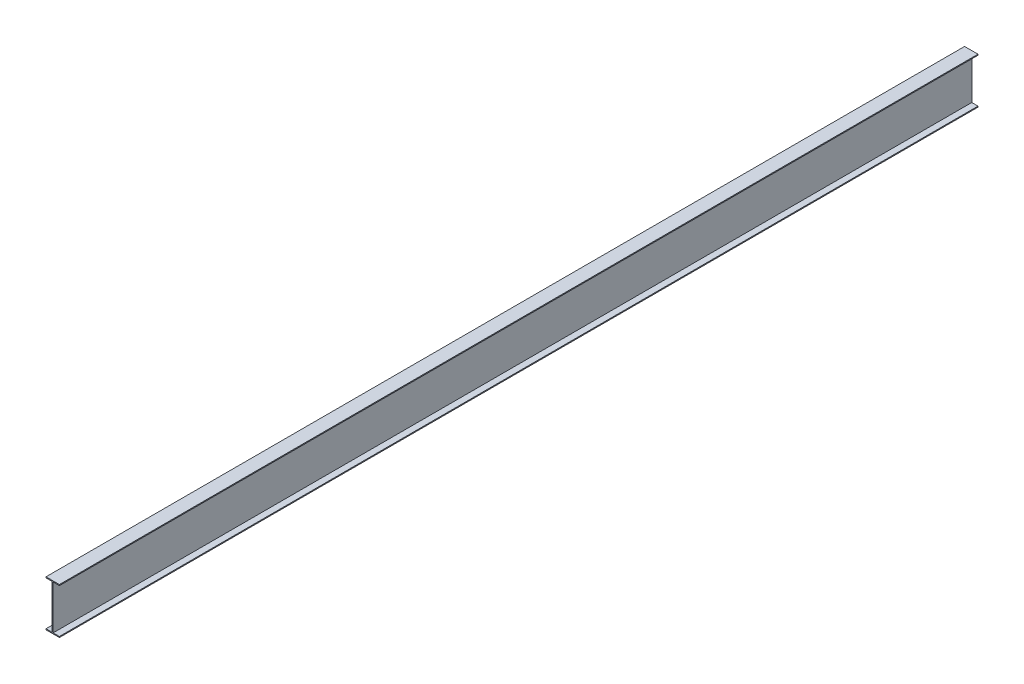
ISO-10303-21;
HEADER;
FILE_DESCRIPTION(('STEP AP214'),'2;1');
FILE_NAME('part.step','',(''),(''),'','','');
FILE_SCHEMA(('AUTOMOTIVE_DESIGN { 1 0 10303 214 1 1 1 1 }'));
ENDSEC;
DATA;
#1=APPLICATION_CONTEXT('core data for automotive mechanical design processes');
#2=APPLICATION_PROTOCOL_DEFINITION('international standard','automotive_design',2000,#1);
#3=PRODUCT_CONTEXT('',#1,'mechanical');
#4=PRODUCT('Part','Part','',(#3));
#5=PRODUCT_RELATED_PRODUCT_CATEGORY('part','',(#4));
#6=PRODUCT_DEFINITION_FORMATION('','',#4);
#7=PRODUCT_DEFINITION_CONTEXT('part definition',#1,'design');
#8=PRODUCT_DEFINITION('design','',#6,#7);
#9=PRODUCT_DEFINITION_SHAPE('','',#8);
#10=(LENGTH_UNIT() NAMED_UNIT(*) SI_UNIT(.MILLI.,.METRE.));
#11=(NAMED_UNIT(*) PLANE_ANGLE_UNIT() SI_UNIT($,.RADIAN.));
#12=(NAMED_UNIT(*) SI_UNIT($,.STERADIAN.) SOLID_ANGLE_UNIT());
#13=UNCERTAINTY_MEASURE_WITH_UNIT(LENGTH_MEASURE(1.E-05),#10,'distance_accuracy_value','');
#14=(GEOMETRIC_REPRESENTATION_CONTEXT(3) GLOBAL_UNCERTAINTY_ASSIGNED_CONTEXT((#13)) GLOBAL_UNIT_ASSIGNED_CONTEXT((#10,
#11,#12)) REPRESENTATION_CONTEXT('',''));
#15=CARTESIAN_POINT('',(0.,0.,0.));
#16=DIRECTION('',(0.,0.,1.));
#17=DIRECTION('',(1.,0.,0.));
#18=AXIS2_PLACEMENT_3D('',#15,#16,#17);
#19=CARTESIAN_POINT('',(6.35000000000003,-292.099999999999,12192.));
#20=DIRECTION('',(0.,-1.,0.));
#21=DIRECTION('',(1.,0.,0.));
#22=AXIS2_PLACEMENT_3D('',#19,#20,#21);
#23=PLANE('',#22);
#24=DIRECTION('',(-1.,0.,0.));
#25=VECTOR('',#24,1.);
#26=CARTESIAN_POINT('',(6.35000000000003,-292.099999999999,0.));
#27=LINE('',#26,#25);
#28=CARTESIAN_POINT('',(88.9,-292.099999999999,0.));
#29=VERTEX_POINT('',#28);
#30=CARTESIAN_POINT('',(6.35000000000003,-292.099999999999,0.));
#31=VERTEX_POINT('',#30);
#32=EDGE_CURVE('E154',#29,#31,#27,.T.);
#33=ORIENTED_EDGE('',*,*,#32,.T.);
#34=DIRECTION('',(0.,0.,-1.));
#35=VECTOR('',#34,1.);
#36=CARTESIAN_POINT('',(6.35000000000003,-292.099999999999,12192.));
#37=LINE('',#36,#35);
#38=CARTESIAN_POINT('',(6.35000000000003,-292.099999999999,12192.));
#39=VERTEX_POINT('',#38);
#40=EDGE_CURVE('E11',#39,#31,#37,.T.);
#41=ORIENTED_EDGE('',*,*,#40,.F.);
#42=DIRECTION('',(-1.,0.,0.));
#43=VECTOR('',#42,1.);
#44=CARTESIAN_POINT('',(6.35000000000003,-292.099999999999,12192.));
#45=LINE('',#44,#43);
#46=CARTESIAN_POINT('',(88.9,-292.099999999999,12192.));
#47=VERTEX_POINT('',#46);
#48=EDGE_CURVE('E176',#47,#39,#45,.T.);
#49=ORIENTED_EDGE('',*,*,#48,.F.);
#50=DIRECTION('',(0.,0.,-1.));
#51=VECTOR('',#50,1.);
#52=CARTESIAN_POINT('',(88.9,-292.099999999999,12192.));
#53=LINE('',#52,#51);
#54=EDGE_CURVE('E150',#47,#29,#53,.T.);
#55=ORIENTED_EDGE('',*,*,#54,.T.);
#56=EDGE_LOOP('',(#33,#41,#49,#55));
#57=FACE_BOUND('',#56,.T.);
#58=ADVANCED_FACE('F34',(#57),#23,.F.);
#59=CARTESIAN_POINT('',(6.34999999999996,292.100000000001,12192.));
#60=DIRECTION('',(-1.,0.,0.));
#61=DIRECTION('',(0.,-1.,0.));
#62=AXIS2_PLACEMENT_3D('',#59,#60,#61);
#63=PLANE('',#62);
#64=DIRECTION('',(0.,1.,0.));
#65=VECTOR('',#64,1.);
#66=CARTESIAN_POINT('',(6.34999999999996,292.100000000001,0.));
#67=LINE('',#66,#65);
#68=CARTESIAN_POINT('',(6.34999999999996,292.100000000001,0.));
#69=VERTEX_POINT('',#68);
#70=EDGE_CURVE('E157',#31,#69,#67,.T.);
#71=ORIENTED_EDGE('',*,*,#70,.T.);
#72=DIRECTION('',(0.,0.,-1.));
#73=VECTOR('',#72,1.);
#74=CARTESIAN_POINT('',(6.34999999999996,292.100000000001,12192.));
#75=LINE('',#74,#73);
#76=CARTESIAN_POINT('',(6.34999999999996,292.100000000001,12192.));
#77=VERTEX_POINT('',#76);
#78=EDGE_CURVE('E42',#77,#69,#75,.T.);
#79=ORIENTED_EDGE('',*,*,#78,.F.);
#80=DIRECTION('',(0.,1.,0.));
#81=VECTOR('',#80,1.);
#82=CARTESIAN_POINT('',(6.34999999999996,292.100000000001,12192.));
#83=LINE('',#82,#81);
#84=EDGE_CURVE('E105',#39,#77,#83,.T.);
#85=ORIENTED_EDGE('',*,*,#84,.F.);
#86=ORIENTED_EDGE('',*,*,#40,.T.);
#87=EDGE_LOOP('',(#71,#79,#85,#86));
#88=FACE_BOUND('',#87,.T.);
#89=ADVANCED_FACE('F254',(#88),#63,.F.);
#90=CARTESIAN_POINT('',(88.9,292.100000000001,12192.));
#91=DIRECTION('',(0.,1.,0.));
#92=DIRECTION('',(0.,0.,1.));
#93=AXIS2_PLACEMENT_3D('',#90,#91,#92);
#94=PLANE('',#93);
#95=DIRECTION('',(1.,0.,0.));
#96=VECTOR('',#95,1.);
#97=CARTESIAN_POINT('',(88.9,292.100000000001,0.));
#98=LINE('',#97,#96);
#99=CARTESIAN_POINT('',(88.9,292.100000000001,0.));
#100=VERTEX_POINT('',#99);
#101=EDGE_CURVE('E159',#69,#100,#98,.T.);
#102=ORIENTED_EDGE('',*,*,#101,.T.);
#103=DIRECTION('',(0.,0.,-1.));
#104=VECTOR('',#103,1.);
#105=CARTESIAN_POINT('',(88.9,292.100000000001,12192.));
#106=LINE('',#105,#104);
#107=CARTESIAN_POINT('',(88.9,292.100000000001,12192.));
#108=VERTEX_POINT('',#107);
#109=EDGE_CURVE('E195',#108,#100,#106,.T.);
#110=ORIENTED_EDGE('',*,*,#109,.F.);
#111=DIRECTION('',(1.,0.,0.));
#112=VECTOR('',#111,1.);
#113=CARTESIAN_POINT('',(88.9,292.100000000001,12192.));
#114=LINE('',#113,#112);
#115=EDGE_CURVE('E203',#77,#108,#114,.T.);
#116=ORIENTED_EDGE('',*,*,#115,.F.);
#117=ORIENTED_EDGE('',*,*,#78,.T.);
#118=EDGE_LOOP('',(#102,#110,#116,#117));
#119=FACE_BOUND('',#118,.T.);
#120=ADVANCED_FACE('F201',(#119),#94,.F.);
#121=CARTESIAN_POINT('',(88.8999999999999,304.800000000001,12192.));
#122=DIRECTION('',(-1.,0.,0.));
#123=DIRECTION('',(0.,-1.,0.));
#124=AXIS2_PLACEMENT_3D('',#121,#122,#123);
#125=PLANE('',#124);
#126=DIRECTION('',(0.,1.,0.));
#127=VECTOR('',#126,1.);
#128=CARTESIAN_POINT('',(88.8999999999999,304.800000000001,0.));
#129=LINE('',#128,#127);
#130=CARTESIAN_POINT('',(88.8999999999999,304.800000000001,0.));
#131=VERTEX_POINT('',#130);
#132=EDGE_CURVE('E161',#100,#131,#129,.T.);
#133=ORIENTED_EDGE('',*,*,#132,.T.);
#134=DIRECTION('',(0.,0.,-1.));
#135=VECTOR('',#134,1.);
#136=CARTESIAN_POINT('',(88.8999999999999,304.800000000001,12192.));
#137=LINE('',#136,#135);
#138=CARTESIAN_POINT('',(88.8999999999999,304.800000000001,12192.));
#139=VERTEX_POINT('',#138);
#140=EDGE_CURVE('E192',#139,#131,#137,.T.);
#141=ORIENTED_EDGE('',*,*,#140,.F.);
#142=DIRECTION('',(0.,1.,0.));
#143=VECTOR('',#142,1.);
#144=CARTESIAN_POINT('',(88.8999999999999,304.800000000001,12192.));
#145=LINE('',#144,#143);
#146=EDGE_CURVE('E221',#108,#139,#145,.T.);
#147=ORIENTED_EDGE('',*,*,#146,.F.);
#148=ORIENTED_EDGE('',*,*,#109,.T.);
#149=EDGE_LOOP('',(#133,#141,#147,#148));
#150=FACE_BOUND('',#149,.T.);
#151=ADVANCED_FACE('F212',(#150),#125,.F.);
#152=CARTESIAN_POINT('',(-88.8999999999999,304.800000000001,12192.));
#153=DIRECTION('',(0.,-1.,0.));
#154=DIRECTION('',(0.,0.,-1.));
#155=AXIS2_PLACEMENT_3D('',#152,#153,#154);
#156=PLANE('',#155);
#157=DIRECTION('',(-1.,0.,0.));
#158=VECTOR('',#157,1.);
#159=CARTESIAN_POINT('',(-88.8999999999999,304.800000000001,0.));
#160=LINE('',#159,#158);
#161=CARTESIAN_POINT('',(-88.8999999999999,304.800000000001,0.));
#162=VERTEX_POINT('',#161);
#163=EDGE_CURVE('E163',#131,#162,#160,.T.);
#164=ORIENTED_EDGE('',*,*,#163,.T.);
#165=DIRECTION('',(0.,0.,-1.));
#166=VECTOR('',#165,1.);
#167=CARTESIAN_POINT('',(-88.8999999999999,304.800000000001,12192.));
#168=LINE('',#167,#166);
#169=CARTESIAN_POINT('',(-88.8999999999999,304.800000000001,12192.));
#170=VERTEX_POINT('',#169);
#171=EDGE_CURVE('E189',#170,#162,#168,.T.);
#172=ORIENTED_EDGE('',*,*,#171,.F.);
#173=DIRECTION('',(-1.,0.,0.));
#174=VECTOR('',#173,1.);
#175=CARTESIAN_POINT('',(-88.8999999999999,304.800000000001,12192.));
#176=LINE('',#175,#174);
#177=EDGE_CURVE('E218',#139,#170,#176,.T.);
#178=ORIENTED_EDGE('',*,*,#177,.F.);
#179=ORIENTED_EDGE('',*,*,#140,.T.);
#180=EDGE_LOOP('',(#164,#172,#178,#179));
#181=FACE_BOUND('',#180,.T.);
#182=ADVANCED_FACE('F216',(#181),#156,.F.);
#183=CARTESIAN_POINT('',(-88.9,292.100000000001,12192.));
#184=DIRECTION('',(1.,0.,0.));
#185=DIRECTION('',(0.,1.,0.));
#186=AXIS2_PLACEMENT_3D('',#183,#184,#185);
#187=PLANE('',#186);
#188=DIRECTION('',(0.,-1.,0.));
#189=VECTOR('',#188,1.);
#190=CARTESIAN_POINT('',(-88.9,292.100000000001,0.));
#191=LINE('',#190,#189);
#192=CARTESIAN_POINT('',(-88.9,292.100000000001,0.));
#193=VERTEX_POINT('',#192);
#194=EDGE_CURVE('E165',#162,#193,#191,.T.);
#195=ORIENTED_EDGE('',*,*,#194,.T.);
#196=DIRECTION('',(0.,0.,-1.));
#197=VECTOR('',#196,1.);
#198=CARTESIAN_POINT('',(-88.9,292.100000000001,12192.));
#199=LINE('',#198,#197);
#200=CARTESIAN_POINT('',(-88.9,292.100000000001,12192.));
#201=VERTEX_POINT('',#200);
#202=EDGE_CURVE('E186',#201,#193,#199,.T.);
#203=ORIENTED_EDGE('',*,*,#202,.F.);
#204=DIRECTION('',(0.,-1.,0.));
#205=VECTOR('',#204,1.);
#206=CARTESIAN_POINT('',(-88.9,292.100000000001,12192.));
#207=LINE('',#206,#205);
#208=EDGE_CURVE('E220',#170,#201,#207,.T.);
#209=ORIENTED_EDGE('',*,*,#208,.F.);
#210=ORIENTED_EDGE('',*,*,#171,.T.);
#211=EDGE_LOOP('',(#195,#203,#209,#210));
#212=FACE_BOUND('',#211,.T.);
#213=ADVANCED_FACE('F267',(#212),#187,.F.);
#214=CARTESIAN_POINT('',(-6.35000000000004,292.100000000001,12192.));
#215=DIRECTION('',(0.,1.,0.));
#216=DIRECTION('',(0.,0.,1.));
#217=AXIS2_PLACEMENT_3D('',#214,#215,#216);
#218=PLANE('',#217);
#219=DIRECTION('',(1.,0.,0.));
#220=VECTOR('',#219,1.);
#221=CARTESIAN_POINT('',(-6.35000000000004,292.100000000001,0.));
#222=LINE('',#221,#220);
#223=CARTESIAN_POINT('',(-6.35000000000004,292.100000000001,0.));
#224=VERTEX_POINT('',#223);
#225=EDGE_CURVE('E167',#193,#224,#222,.T.);
#226=ORIENTED_EDGE('',*,*,#225,.T.);
#227=DIRECTION('',(0.,0.,-1.));
#228=VECTOR('',#227,1.);
#229=CARTESIAN_POINT('',(-6.35000000000004,292.100000000001,12192.));
#230=LINE('',#229,#228);
#231=CARTESIAN_POINT('',(-6.35000000000004,292.100000000001,12192.));
#232=VERTEX_POINT('',#231);
#233=EDGE_CURVE('E183',#232,#224,#230,.T.);
#234=ORIENTED_EDGE('',*,*,#233,.F.);
#235=DIRECTION('',(1.,0.,0.));
#236=VECTOR('',#235,1.);
#237=CARTESIAN_POINT('',(-6.35000000000004,292.100000000001,12192.));
#238=LINE('',#237,#236);
#239=EDGE_CURVE('E223',#201,#232,#238,.T.);
#240=ORIENTED_EDGE('',*,*,#239,.F.);
#241=ORIENTED_EDGE('',*,*,#202,.T.);
#242=EDGE_LOOP('',(#226,#234,#240,#241));
#243=FACE_BOUND('',#242,.T.);
#244=ADVANCED_FACE('F270',(#243),#218,.F.);
#245=CARTESIAN_POINT('',(-6.35000000000004,292.100000000001,12192.));
#246=DIRECTION('',(1.,0.,0.));
#247=DIRECTION('',(0.,1.,0.));
#248=AXIS2_PLACEMENT_3D('',#245,#246,#247);
#249=PLANE('',#248);
#250=DIRECTION('',(0.,-1.,0.));
#251=VECTOR('',#250,1.);
#252=CARTESIAN_POINT('',(-6.35000000000004,292.100000000001,0.));
#253=LINE('',#252,#251);
#254=CARTESIAN_POINT('',(-6.34999999999997,-292.099999999999,0.));
#255=VERTEX_POINT('',#254);
#256=EDGE_CURVE('E169',#224,#255,#253,.T.);
#257=ORIENTED_EDGE('',*,*,#256,.T.);
#258=DIRECTION('',(0.,0.,-1.));
#259=VECTOR('',#258,1.);
#260=CARTESIAN_POINT('',(-6.34999999999997,-292.099999999999,12192.));
#261=LINE('',#260,#259);
#262=CARTESIAN_POINT('',(-6.34999999999997,-292.099999999999,12192.));
#263=VERTEX_POINT('',#262);
#264=EDGE_CURVE('E180',#263,#255,#261,.T.);
#265=ORIENTED_EDGE('',*,*,#264,.F.);
#266=DIRECTION('',(0.,-1.,0.));
#267=VECTOR('',#266,1.);
#268=CARTESIAN_POINT('',(-6.35000000000004,292.100000000001,12192.));
#269=LINE('',#268,#267);
#270=EDGE_CURVE('E229',#232,#263,#269,.T.);
#271=ORIENTED_EDGE('',*,*,#270,.F.);
#272=ORIENTED_EDGE('',*,*,#233,.T.);
#273=EDGE_LOOP('',(#257,#265,#271,#272));
#274=FACE_BOUND('',#273,.T.);
#275=ADVANCED_FACE('F235',(#274),#249,.F.);
#276=CARTESIAN_POINT('',(-88.9,-292.099999999999,12192.));
#277=DIRECTION('',(0.,-1.,0.));
#278=DIRECTION('',(1.,0.,0.));
#279=AXIS2_PLACEMENT_3D('',#276,#277,#278);
#280=PLANE('',#279);
#281=DIRECTION('',(-1.,0.,0.));
#282=VECTOR('',#281,1.);
#283=CARTESIAN_POINT('',(-88.9,-292.099999999999,0.));
#284=LINE('',#283,#282);
#285=CARTESIAN_POINT('',(-88.9,-292.099999999999,0.));
#286=VERTEX_POINT('',#285);
#287=EDGE_CURVE('E171',#255,#286,#284,.T.);
#288=ORIENTED_EDGE('',*,*,#287,.T.);
#289=DIRECTION('',(0.,0.,-1.));
#290=VECTOR('',#289,1.);
#291=CARTESIAN_POINT('',(-88.9,-292.099999999999,12192.));
#292=LINE('',#291,#290);
#293=CARTESIAN_POINT('',(-88.9,-292.099999999999,12192.));
#294=VERTEX_POINT('',#293);
#295=EDGE_CURVE('E145',#294,#286,#292,.T.);
#296=ORIENTED_EDGE('',*,*,#295,.F.);
#297=DIRECTION('',(-1.,0.,0.));
#298=VECTOR('',#297,1.);
#299=CARTESIAN_POINT('',(-88.9,-292.099999999999,12192.));
#300=LINE('',#299,#298);
#301=EDGE_CURVE('E136',#263,#294,#300,.T.);
#302=ORIENTED_EDGE('',*,*,#301,.F.);
#303=ORIENTED_EDGE('',*,*,#264,.T.);
#304=EDGE_LOOP('',(#288,#296,#302,#303));
#305=FACE_BOUND('',#304,.T.);
#306=ADVANCED_FACE('F239',(#305),#280,.F.);
#307=CARTESIAN_POINT('',(-88.9,-304.799999999999,12192.));
#308=DIRECTION('',(1.,0.,0.));
#309=DIRECTION('',(0.,1.,0.));
#310=AXIS2_PLACEMENT_3D('',#307,#308,#309);
#311=PLANE('',#310);
#312=DIRECTION('',(0.,-1.,0.));
#313=VECTOR('',#312,1.);
#314=CARTESIAN_POINT('',(-88.9,-304.799999999999,0.));
#315=LINE('',#314,#313);
#316=CARTESIAN_POINT('',(-88.9,-304.799999999999,0.));
#317=VERTEX_POINT('',#316);
#318=EDGE_CURVE('E144',#286,#317,#315,.T.);
#319=ORIENTED_EDGE('',*,*,#318,.T.);
#320=DIRECTION('',(0.,0.,-1.));
#321=VECTOR('',#320,1.);
#322=CARTESIAN_POINT('',(-88.9,-304.799999999999,12192.));
#323=LINE('',#322,#321);
#324=CARTESIAN_POINT('',(-88.9,-304.799999999999,12192.));
#325=VERTEX_POINT('',#324);
#326=EDGE_CURVE('E141',#325,#317,#323,.T.);
#327=ORIENTED_EDGE('',*,*,#326,.F.);
#328=DIRECTION('',(0.,-1.,0.));
#329=VECTOR('',#328,1.);
#330=CARTESIAN_POINT('',(-88.9,-304.799999999999,12192.));
#331=LINE('',#330,#329);
#332=EDGE_CURVE('E130',#294,#325,#331,.T.);
#333=ORIENTED_EDGE('',*,*,#332,.F.);
#334=ORIENTED_EDGE('',*,*,#295,.T.);
#335=EDGE_LOOP('',(#319,#327,#333,#334));
#336=FACE_BOUND('',#335,.T.);
#337=ADVANCED_FACE('F142',(#336),#311,.F.);
#338=CARTESIAN_POINT('',(88.9,-304.799999999999,12192.));
#339=DIRECTION('',(0.,1.,0.));
#340=DIRECTION('',(0.,0.,1.));
#341=AXIS2_PLACEMENT_3D('',#338,#339,#340);
#342=PLANE('',#341);
#343=DIRECTION('',(1.,0.,0.));
#344=VECTOR('',#343,1.);
#345=CARTESIAN_POINT('',(88.9,-304.799999999999,0.));
#346=LINE('',#345,#344);
#347=CARTESIAN_POINT('',(88.9,-304.799999999999,0.));
#348=VERTEX_POINT('',#347);
#349=EDGE_CURVE('E91',#317,#348,#346,.T.);
#350=ORIENTED_EDGE('',*,*,#349,.T.);
#351=DIRECTION('',(0.,0.,-1.));
#352=VECTOR('',#351,1.);
#353=CARTESIAN_POINT('',(88.9,-304.799999999999,12192.));
#354=LINE('',#353,#352);
#355=CARTESIAN_POINT('',(88.9,-304.799999999999,12192.));
#356=VERTEX_POINT('',#355);
#357=EDGE_CURVE('E146',#356,#348,#354,.T.);
#358=ORIENTED_EDGE('',*,*,#357,.F.);
#359=DIRECTION('',(1.,0.,0.));
#360=VECTOR('',#359,1.);
#361=CARTESIAN_POINT('',(88.9,-304.799999999999,12192.));
#362=LINE('',#361,#360);
#363=EDGE_CURVE('E134',#325,#356,#362,.T.);
#364=ORIENTED_EDGE('',*,*,#363,.F.);
#365=ORIENTED_EDGE('',*,*,#326,.T.);
#366=EDGE_LOOP('',(#350,#358,#364,#365));
#367=FACE_BOUND('',#366,.T.);
#368=ADVANCED_FACE('F148',(#367),#342,.F.);
#369=CARTESIAN_POINT('',(88.9,-292.099999999999,12192.));
#370=DIRECTION('',(-1.,0.,0.));
#371=DIRECTION('',(0.,-1.,0.));
#372=AXIS2_PLACEMENT_3D('',#369,#370,#371);
#373=PLANE('',#372);
#374=DIRECTION('',(0.,1.,0.));
#375=VECTOR('',#374,1.);
#376=CARTESIAN_POINT('',(88.9,-292.099999999999,0.));
#377=LINE('',#376,#375);
#378=EDGE_CURVE('E97',#348,#29,#377,.T.);
#379=ORIENTED_EDGE('',*,*,#378,.T.);
#380=ORIENTED_EDGE('',*,*,#54,.F.);
#381=DIRECTION('',(0.,1.,0.));
#382=VECTOR('',#381,1.);
#383=CARTESIAN_POINT('',(88.9,-292.099999999999,12192.));
#384=LINE('',#383,#382);
#385=EDGE_CURVE('E50',#356,#47,#384,.T.);
#386=ORIENTED_EDGE('',*,*,#385,.F.);
#387=ORIENTED_EDGE('',*,*,#357,.T.);
#388=EDGE_LOOP('',(#379,#380,#386,#387));
#389=FACE_BOUND('',#388,.T.);
#390=ADVANCED_FACE('F243',(#389),#373,.F.);
#391=CARTESIAN_POINT('',(0.,0.,12192.));
#392=DIRECTION('',(0.,0.,-1.));
#393=DIRECTION('',(-1.,0.,0.));
#394=AXIS2_PLACEMENT_3D('',#391,#392,#393);
#395=PLANE('',#394);
#396=ORIENTED_EDGE('',*,*,#48,.T.);
#397=ORIENTED_EDGE('',*,*,#84,.T.);
#398=ORIENTED_EDGE('',*,*,#115,.T.);
#399=ORIENTED_EDGE('',*,*,#146,.T.);
#400=ORIENTED_EDGE('',*,*,#177,.T.);
#401=ORIENTED_EDGE('',*,*,#208,.T.);
#402=ORIENTED_EDGE('',*,*,#239,.T.);
#403=ORIENTED_EDGE('',*,*,#270,.T.);
#404=ORIENTED_EDGE('',*,*,#301,.T.);
#405=ORIENTED_EDGE('',*,*,#332,.T.);
#406=ORIENTED_EDGE('',*,*,#363,.T.);
#407=ORIENTED_EDGE('',*,*,#385,.T.);
#408=EDGE_LOOP('',(#396,#397,#398,#399,#400,#401,#402,#403,#404,#405,#406,#407));
#409=FACE_BOUND('',#408,.T.);
#410=ADVANCED_FACE('F132',(#409),#395,.F.);
#411=CARTESIAN_POINT('',(0.,0.,0.));
#412=DIRECTION('',(0.,0.,-1.));
#413=DIRECTION('',(-1.,0.,0.));
#414=AXIS2_PLACEMENT_3D('',#411,#412,#413);
#415=PLANE('',#414);
#416=ORIENTED_EDGE('',*,*,#32,.F.);
#417=ORIENTED_EDGE('',*,*,#378,.F.);
#418=ORIENTED_EDGE('',*,*,#349,.F.);
#419=ORIENTED_EDGE('',*,*,#318,.F.);
#420=ORIENTED_EDGE('',*,*,#287,.F.);
#421=ORIENTED_EDGE('',*,*,#256,.F.);
#422=ORIENTED_EDGE('',*,*,#225,.F.);
#423=ORIENTED_EDGE('',*,*,#194,.F.);
#424=ORIENTED_EDGE('',*,*,#163,.F.);
#425=ORIENTED_EDGE('',*,*,#132,.F.);
#426=ORIENTED_EDGE('',*,*,#101,.F.);
#427=ORIENTED_EDGE('',*,*,#70,.F.);
#428=EDGE_LOOP('',(#416,#417,#418,#419,#420,#421,#422,#423,#424,#425,#426,#427));
#429=FACE_BOUND('',#428,.T.);
#430=ADVANCED_FACE('F207',(#429),#415,.T.);
#431=CLOSED_SHELL('',(#58,#89,#120,#151,#182,#213,#244,#275,#306,#337,#368,#390,#410,#430));
#432=MANIFOLD_SOLID_BREP('B2',#431);
#433=ADVANCED_BREP_SHAPE_REPRESENTATION('',(#18,#432),#14);
#434=SHAPE_DEFINITION_REPRESENTATION(#9,#433);
ENDSEC;
END-ISO-10303-21;
